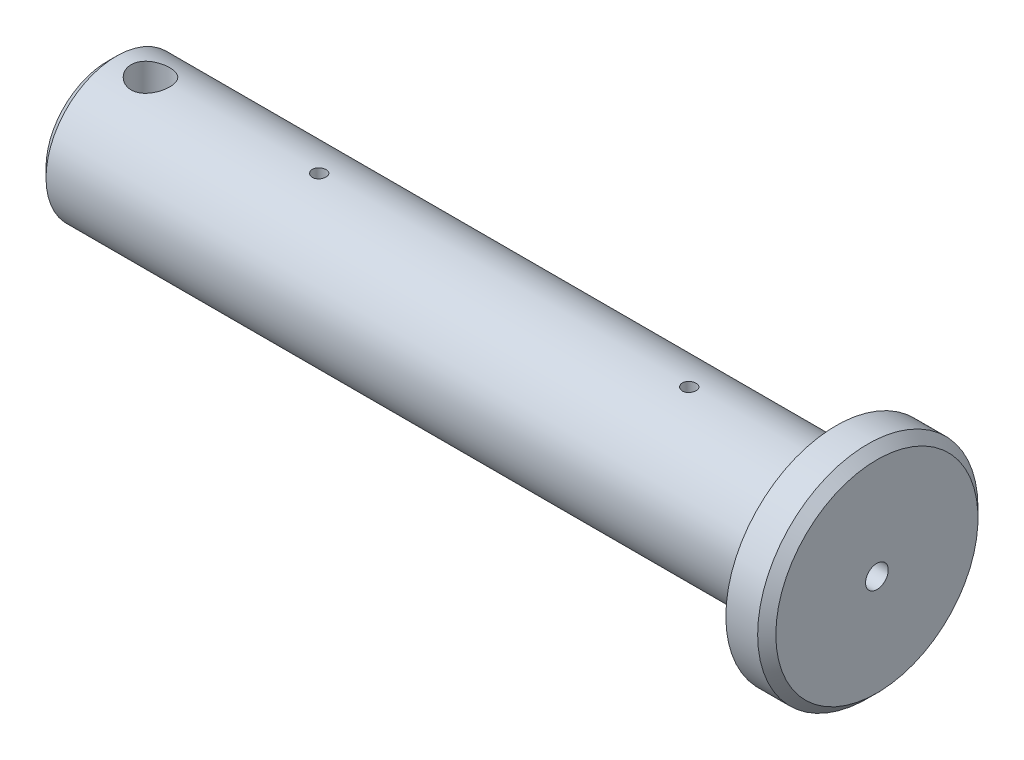
ISO-10303-21;
HEADER;
FILE_DESCRIPTION(('STEP AP214'),'2;1');
FILE_NAME('part.step','',(''),(''),'','','');
FILE_SCHEMA(('AUTOMOTIVE_DESIGN { 1 0 10303 214 1 1 1 1 }'));
ENDSEC;
DATA;
#1=APPLICATION_CONTEXT('core data for automotive mechanical design processes');
#2=APPLICATION_PROTOCOL_DEFINITION('international standard','automotive_design',2000,#1);
#3=PRODUCT_CONTEXT('',#1,'mechanical');
#4=PRODUCT('Part','Part','',(#3));
#5=PRODUCT_RELATED_PRODUCT_CATEGORY('part','',(#4));
#6=PRODUCT_DEFINITION_FORMATION('','',#4);
#7=PRODUCT_DEFINITION_CONTEXT('part definition',#1,'design');
#8=PRODUCT_DEFINITION('design','',#6,#7);
#9=PRODUCT_DEFINITION_SHAPE('','',#8);
#10=(LENGTH_UNIT() NAMED_UNIT(*) SI_UNIT(.MILLI.,.METRE.));
#11=(NAMED_UNIT(*) PLANE_ANGLE_UNIT() SI_UNIT($,.RADIAN.));
#12=(NAMED_UNIT(*) SI_UNIT($,.STERADIAN.) SOLID_ANGLE_UNIT());
#13=UNCERTAINTY_MEASURE_WITH_UNIT(LENGTH_MEASURE(1.E-05),#10,'distance_accuracy_value','');
#14=(GEOMETRIC_REPRESENTATION_CONTEXT(3) GLOBAL_UNCERTAINTY_ASSIGNED_CONTEXT((#13)) GLOBAL_UNIT_ASSIGNED_CONTEXT((#10,
#11,#12)) REPRESENTATION_CONTEXT('',''));
#15=CARTESIAN_POINT('',(0.,0.,0.));
#16=DIRECTION('',(0.,0.,1.));
#17=DIRECTION('',(1.,0.,0.));
#18=AXIS2_PLACEMENT_3D('',#15,#16,#17);
#19=CARTESIAN_POINT('',(-84.69,0.,0.));
#20=DIRECTION('',(-1.,0.,0.));
#21=DIRECTION('',(0.,0.,1.));
#22=AXIS2_PLACEMENT_3D('',#19,#20,#21);
#23=CYLINDRICAL_SURFACE('',#22,1.49999999999999);
#24=CARTESIAN_POINT('',(-38.05,0.,0.));
#25=DIRECTION('',(-0.707106781186547,-0.707106781186547,0.));
#26=DIRECTION('',(-0.707106781186547,0.707106781186547,0.));
#27=AXIS2_PLACEMENT_3D('',#24,#25,#26);
#28=ELLIPSE('',#27,2.12132034355964,1.5);
#29=CARTESIAN_POINT('',(-38.05,0.,1.49999999999999));
#30=VERTEX_POINT('',#29);
#31=CARTESIAN_POINT('',(-38.05,0.,-1.49999999999999));
#32=VERTEX_POINT('',#31);
#33=EDGE_CURVE('E71',#30,#32,#28,.T.);
#34=ORIENTED_EDGE('',*,*,#33,.F.);
#35=CARTESIAN_POINT('',(-38.05,0.,0.));
#36=DIRECTION('',(-0.707106781186547,0.707106781186547,0.));
#37=DIRECTION('',(-0.707106781186547,-0.707106781186547,0.));
#38=AXIS2_PLACEMENT_3D('',#35,#36,#37);
#39=ELLIPSE('',#38,2.12132034355964,1.5);
#40=EDGE_CURVE('E79',#32,#30,#39,.F.);
#41=ORIENTED_EDGE('',*,*,#40,.F.);
#42=EDGE_LOOP('',(#34,#41));
#43=FACE_BOUND('',#42,.T.);
#44=CARTESIAN_POINT('',(74.0891393809725,0.,0.));
#45=DIRECTION('',(-1.,0.,0.));
#46=DIRECTION('',(0.,0.,1.));
#47=AXIS2_PLACEMENT_3D('',#44,#45,#46);
#48=CIRCLE('',#47,1.5);
#49=CARTESIAN_POINT('',(74.0891393809725,0.,1.5));
#50=VERTEX_POINT('',#49);
#51=EDGE_CURVE('E57',#50,#50,#48,.T.);
#52=ORIENTED_EDGE('',*,*,#51,.F.);
#53=EDGE_LOOP('',(#52));
#54=FACE_BOUND('',#53,.T.);
#55=CARTESIAN_POINT('',(-43.7887090714587,0.,0.));
#56=DIRECTION('',(-1.,0.,0.));
#57=DIRECTION('',(0.,0.,1.));
#58=AXIS2_PLACEMENT_3D('',#55,#56,#57);
#59=CIRCLE('',#58,1.49999999999999);
#60=CARTESIAN_POINT('',(-43.7887090714587,0.,1.49999999999999));
#61=VERTEX_POINT('',#60);
#62=EDGE_CURVE('E11',#61,#61,#59,.T.);
#63=ORIENTED_EDGE('',*,*,#62,.T.);
#64=EDGE_LOOP('',(#63));
#65=FACE_BOUND('',#64,.T.);
#66=CARTESIAN_POINT('',(43.39,0.,0.));
#67=DIRECTION('',(-0.707106781186547,-0.707106781186547,0.));
#68=DIRECTION('',(-0.707106781186547,0.707106781186547,0.));
#69=AXIS2_PLACEMENT_3D('',#66,#67,#68);
#70=ELLIPSE('',#69,2.12132034355964,1.5);
#71=CARTESIAN_POINT('',(43.39,0.,1.49999999999999));
#72=VERTEX_POINT('',#71);
#73=CARTESIAN_POINT('',(43.39,0.,-1.49999999999999));
#74=VERTEX_POINT('',#73);
#75=EDGE_CURVE('E64',#72,#74,#70,.T.);
#76=ORIENTED_EDGE('',*,*,#75,.F.);
#77=CARTESIAN_POINT('',(43.39,0.,0.));
#78=DIRECTION('',(-0.707106781186547,0.707106781186547,0.));
#79=DIRECTION('',(-0.707106781186547,-0.707106781186547,0.));
#80=AXIS2_PLACEMENT_3D('',#77,#78,#79);
#81=ELLIPSE('',#80,2.12132034355964,1.5);
#82=EDGE_CURVE('E88',#74,#72,#81,.F.);
#83=ORIENTED_EDGE('',*,*,#82,.F.);
#84=EDGE_LOOP('',(#76,#83));
#85=FACE_BOUND('',#84,.T.);
#86=ADVANCED_FACE('F43',(#43,#54,#65,#85),#23,.F.);
#87=CARTESIAN_POINT('',(-84.69,0.,0.));
#88=DIRECTION('',(-1.,0.,0.));
#89=DIRECTION('',(0.,0.,1.));
#90=AXIS2_PLACEMENT_3D('',#87,#88,#89);
#91=CYLINDRICAL_SURFACE('',#90,15.5);
#92=CARTESIAN_POINT('',(-75.19,-14.9059551857638,4.25000000000001));
#93=CARTESIAN_POINT('',(-74.9561425685737,-14.9059589746067,4.24999488522443));
#94=CARTESIAN_POINT('',(-74.7222320276617,-14.9115188036944,4.23063214644481));
#95=CARTESIAN_POINT('',(-74.2611843252749,-14.9330861659049,4.15385079292532));
#96=CARTESIAN_POINT('',(-74.034050361403,-14.9490985521307,4.09641450051364));
#97=CARTESIAN_POINT('',(-73.5932927776466,-14.9896241970183,3.94553055670863));
#98=CARTESIAN_POINT('',(-73.3796499481119,-15.014125031094,3.85213551620893));
#99=CARTESIAN_POINT('',(-72.9710273981969,-15.0688509028496,3.6321519553497));
#100=CARTESIAN_POINT('',(-72.7760494313701,-15.0990764775727,3.50556032035812));
#101=CARTESIAN_POINT('',(-72.4051362387553,-15.1627418652733,3.21919692306056));
#102=CARTESIAN_POINT('',(-72.2297675853123,-15.1962412382274,3.05870439202163));
#103=CARTESIAN_POINT('',(-71.9080677612998,-15.2621667890378,2.71064396300684));
#104=CARTESIAN_POINT('',(-71.7617397483361,-15.2945928498733,2.52307312461682));
#105=CARTESIAN_POINT('',(-71.4998913025484,-15.3553854582037,2.12222978962299));
#106=CARTESIAN_POINT('',(-71.3849372578438,-15.3836735693965,1.9085743727651));
#107=CARTESIAN_POINT('',(-71.1927989655239,-15.4323177349871,1.46406257328755));
#108=CARTESIAN_POINT('',(-71.115607969622,-15.452675206464,1.23320927244565));
#109=CARTESIAN_POINT('',(-71.003029534185,-15.4827431563298,0.766771757966202));
#110=CARTESIAN_POINT('',(-70.9666775785766,-15.4926988815174,0.531436426250146));
#111=CARTESIAN_POINT('',(-70.9337712804948,-15.5017004118799,0.0578109376308894));
#112=CARTESIAN_POINT('',(-70.9372099105527,-15.5007481435306,-0.180478690084372));
#113=CARTESIAN_POINT('',(-70.9831148124032,-15.4882193102902,-0.646523777582157));
#114=CARTESIAN_POINT('',(-71.0245385137781,-15.4769265705426,-0.874390731987508));
#115=CARTESIAN_POINT('',(-71.1435493463301,-15.4453227170116,-1.31980593378543));
#116=CARTESIAN_POINT('',(-71.2211385966859,-15.4250110747544,-1.53735357567812));
#117=CARTESIAN_POINT('',(-71.4110565745773,-15.3772368866856,-1.95857637040681));
#118=CARTESIAN_POINT('',(-71.523736087884,-15.3497025975388,-2.16208489172741));
#119=CARTESIAN_POINT('',(-71.7803651564166,-15.2904400787306,-2.54765573900489));
#120=CARTESIAN_POINT('',(-71.9243211055055,-15.2587109920439,-2.72971366804827));
#121=CARTESIAN_POINT('',(-72.2449244246596,-15.1932749745251,-3.07343931000042));
#122=CARTESIAN_POINT('',(-72.4224800354133,-15.1595372699986,-3.23425504529121));
#123=CARTESIAN_POINT('',(-72.8023857546962,-15.0948080169217,-3.52404291190807));
#124=CARTESIAN_POINT('',(-73.0047375580112,-15.0638166563299,-3.65301286479991));
#125=CARTESIAN_POINT('',(-73.430423427954,-15.0079600434263,-3.87614695434802));
#126=CARTESIAN_POINT('',(-73.653891594839,-14.9831381611681,-3.97006688744779));
#127=CARTESIAN_POINT('',(-74.1142991756873,-14.9429632788265,-4.11871871775668));
#128=CARTESIAN_POINT('',(-74.3512350094966,-14.9276077750034,-4.17346097759179));
#129=CARTESIAN_POINT('',(-74.823853307174,-14.9086412339289,-4.24070836537975));
#130=CARTESIAN_POINT('',(-75.0593401472162,-14.9046754782246,-4.2544896602924));
#131=CARTESIAN_POINT('',(-75.5292560465583,-14.9079646659928,-4.24295040309155));
#132=CARTESIAN_POINT('',(-75.7636852227934,-14.9152183369659,-4.21763428537876));
#133=CARTESIAN_POINT('',(-76.2198283303444,-14.9397852018905,-4.12974654456128));
#134=CARTESIAN_POINT('',(-76.44170475715,-14.9568879428801,-4.06795367751815));
#135=CARTESIAN_POINT('',(-76.8719408324438,-14.9990175933463,-3.90974796893046));
#136=CARTESIAN_POINT('',(-77.0802986376794,-15.0240455806992,-3.81333041800276));
#137=CARTESIAN_POINT('',(-77.4828900510291,-15.0799249947055,-3.58605876975781));
#138=CARTESIAN_POINT('',(-77.676687033127,-15.1108974254731,-3.45446167916887));
#139=CARTESIAN_POINT('',(-78.0399157488401,-15.1748967565304,-3.16147897621475));
#140=CARTESIAN_POINT('',(-78.2093426185513,-15.2079240650634,-3.00008743196617));
#141=CARTESIAN_POINT('',(-78.5243801839865,-15.2735419232601,-2.64617301921005));
#142=CARTESIAN_POINT('',(-78.6690976488661,-15.3060877641918,-2.45284504731041));
#143=CARTESIAN_POINT('',(-78.9240321586473,-15.3660370665979,-2.04390471018055));
#144=CARTESIAN_POINT('',(-79.0342510374639,-15.3934408013913,-1.82829353031725));
#145=CARTESIAN_POINT('',(-79.2160288888176,-15.4398416416358,-1.38242251921242));
#146=CARTESIAN_POINT('',(-79.2878791468457,-15.4589018834113,-1.15228833379477));
#147=CARTESIAN_POINT('',(-79.3917084949337,-15.4867465190554,-0.682608118597718));
#148=CARTESIAN_POINT('',(-79.4236969670676,-15.4955333309008,-0.443064317210369));
#149=CARTESIAN_POINT('',(-79.4462791558743,-15.5017196678931,0.0303110813249502));
#150=CARTESIAN_POINT('',(-79.4381796490136,-15.4994786878096,0.264076498197157));
#151=CARTESIAN_POINT('',(-79.3838693918906,-15.4846816527614,0.726785748202853));
#152=CARTESIAN_POINT('',(-79.3376602212142,-15.4721260253226,0.955729780771838));
#153=CARTESIAN_POINT('',(-79.2091977944424,-15.4381889050738,1.40063034563142));
#154=CARTESIAN_POINT('',(-79.1272230594416,-15.4168756844443,1.61667285445488));
#155=CARTESIAN_POINT('',(-78.9298043886581,-15.3676455958708,2.03205974292101));
#156=CARTESIAN_POINT('',(-78.814355558461,-15.3397277623435,2.23140167519126));
#157=CARTESIAN_POINT('',(-78.5495167015816,-15.2792934706519,2.61375767900484));
#158=CARTESIAN_POINT('',(-78.399270066712,-15.2466704959798,2.79616151720711));
#159=CARTESIAN_POINT('',(-78.0707071847019,-15.180912762456,3.13360889027573));
#160=CARTESIAN_POINT('',(-77.892383420301,-15.1477778686939,3.28864507418654));
#161=CARTESIAN_POINT('',(-77.5076626578839,-15.0838420957925,3.5705945393854));
#162=CARTESIAN_POINT('',(-77.3007020291748,-15.0531148378429,3.69675701088007));
#163=CARTESIAN_POINT('',(-76.8676898453251,-14.9985392398652,3.9123222426296));
#164=CARTESIAN_POINT('',(-76.6416501962378,-14.9746866502117,4.00174772672291));
#165=CARTESIAN_POINT('',(-76.2122248559673,-14.9396718733312,4.130366453834));
#166=CARTESIAN_POINT('',(-76.0106003557514,-14.9271339479147,4.17511996078346));
#167=CARTESIAN_POINT('',(-75.6026639463207,-14.910274465581,4.23493706424275));
#168=CARTESIAN_POINT('',(-75.3963526488424,-14.9059518425399,4.25000451320911));
#169=CARTESIAN_POINT('',(-75.19,-14.9059551857638,4.25000000000001));
#170=B_SPLINE_CURVE_WITH_KNOTS('',3,(#92,#93,#94,#95,#96,#97,#98,#99,#100,#101,#102,#103,#104,
#105,#106,#107,#108,#109,#110,#111,#112,#113,#114,#115,#116,#117,#118,#119,#120,#121,#122,#123,
#124,#125,#126,#127,#128,#129,#130,#131,#132,#133,#134,#135,#136,#137,#138,#139,#140,#141,#142,
#143,#144,#145,#146,#147,#148,#149,#150,#151,#152,#153,#154,#155,#156,#157,#158,#159,#160,#161,
#162,#163,#164,#165,#166,#167,#168,#169),.UNSPECIFIED.,.T.,.F.,(4,2,2,2,2,2,2,2,2,2,2,2,2,2,2,2,
2,2,2,2,2,2,2,2,2,2,2,2,2,2,2,2,2,2,2,2,2,2,4),(0.,0.700813005442095,1.40195162871364,
2.10206829737107,2.80225067718094,3.51916932831063,4.2361658877673,4.96535881153612,
5.6944213803148,6.40587747651871,7.11720792342215,7.80958065973359,8.5019939718419,
9.20156422715699,9.90127763088445,10.6236664765061,11.3461047239884,12.0734863818195,
12.8006755735845,13.5049580187297,14.2091605905273,14.8988464856265,15.5886262220461,
16.2943159100148,17.0001462480639,17.7276948828281,18.4552048351627,19.1771102232133,
19.8988456678026,20.5972121802511,21.2955497479553,21.98854352139,22.6816386720414,
23.3940589625466,24.1066703190278,24.8361145903639,25.5651069786263,26.183575204833,
26.8019631651136),.UNSPECIFIED.);
#171=CARTESIAN_POINT('',(-75.19,-14.9059551857638,4.25000000000001));
#172=VERTEX_POINT('',#171);
#173=EDGE_CURVE('E47',#172,#172,#170,.T.);
#174=ORIENTED_EDGE('',*,*,#173,.T.);
#175=EDGE_LOOP('',(#174));
#176=FACE_BOUND('',#175,.T.);
#177=CARTESIAN_POINT('',(-75.19,14.9059551857638,4.25000000000001));
#178=CARTESIAN_POINT('',(-75.4238574314264,14.9059589746067,4.24999488522443));
#179=CARTESIAN_POINT('',(-75.6577679723383,14.9115188036944,4.23063214644481));
#180=CARTESIAN_POINT('',(-76.1188156747251,14.9330861659049,4.15385079292532));
#181=CARTESIAN_POINT('',(-76.345949638597,14.9490985521307,4.09641450051364));
#182=CARTESIAN_POINT('',(-76.7867072223534,14.9896241970183,3.94553055670863));
#183=CARTESIAN_POINT('',(-77.0003500518882,15.014125031094,3.85213551620893));
#184=CARTESIAN_POINT('',(-77.4089726018032,15.0688509028496,3.6321519553497));
#185=CARTESIAN_POINT('',(-77.6039505686299,15.0990764775727,3.50556032035812));
#186=CARTESIAN_POINT('',(-77.9748637612447,15.1627418652733,3.21919692306056));
#187=CARTESIAN_POINT('',(-78.1502324146877,15.1962412382274,3.05870439202163));
#188=CARTESIAN_POINT('',(-78.4719322387002,15.2621667890378,2.71064396300684));
#189=CARTESIAN_POINT('',(-78.618260251664,15.2945928498733,2.52307312461682));
#190=CARTESIAN_POINT('',(-78.8801086974516,15.3553854582037,2.12222978962299));
#191=CARTESIAN_POINT('',(-78.9950627421562,15.3836735693965,1.9085743727651));
#192=CARTESIAN_POINT('',(-79.1872010344762,15.4323177349871,1.46406257328755));
#193=CARTESIAN_POINT('',(-79.264392030378,15.452675206464,1.23320927244565));
#194=CARTESIAN_POINT('',(-79.376970465815,15.4827431563298,0.766771757966203));
#195=CARTESIAN_POINT('',(-79.4133224214235,15.4926988815174,0.531436426250147));
#196=CARTESIAN_POINT('',(-79.4462287195052,15.5017004118799,0.05781093763089));
#197=CARTESIAN_POINT('',(-79.4427900894473,15.5007481435306,-0.180478690084371));
#198=CARTESIAN_POINT('',(-79.3968851875969,15.4882193102902,-0.646523777582157));
#199=CARTESIAN_POINT('',(-79.355461486222,15.4769265705426,-0.874390731987508));
#200=CARTESIAN_POINT('',(-79.2364506536699,15.4453227170116,-1.31980593378543));
#201=CARTESIAN_POINT('',(-79.1588614033142,15.4250110747544,-1.53735357567812));
#202=CARTESIAN_POINT('',(-78.9689434254227,15.3772368866856,-1.95857637040681));
#203=CARTESIAN_POINT('',(-78.8562639121161,15.3497025975388,-2.16208489172742));
#204=CARTESIAN_POINT('',(-78.5996348435834,15.2904400787306,-2.54765573900489));
#205=CARTESIAN_POINT('',(-78.4556788944945,15.2587109920439,-2.72971366804827));
#206=CARTESIAN_POINT('',(-78.1350755753405,15.1932749745251,-3.07343931000042));
#207=CARTESIAN_POINT('',(-77.9575199645867,15.1595372699986,-3.2342550452912));
#208=CARTESIAN_POINT('',(-77.5776142453039,15.0948080169217,-3.52404291190806));
#209=CARTESIAN_POINT('',(-77.3752624419889,15.0638166563299,-3.6530128647999));
#210=CARTESIAN_POINT('',(-76.9495765720461,15.0079600434263,-3.87614695434802));
#211=CARTESIAN_POINT('',(-76.7261084051611,14.9831381611681,-3.97006688744778));
#212=CARTESIAN_POINT('',(-76.2657008243127,14.9429632788265,-4.11871871775667));
#213=CARTESIAN_POINT('',(-76.0287649905035,14.9276077750034,-4.17346097759179));
#214=CARTESIAN_POINT('',(-75.556146692826,14.9086412339289,-4.24070836537975));
#215=CARTESIAN_POINT('',(-75.3206598527839,14.9046754782246,-4.2544896602924));
#216=CARTESIAN_POINT('',(-74.8507439534417,14.9079646659928,-4.24295040309155));
#217=CARTESIAN_POINT('',(-74.6163147772067,14.9152183369659,-4.21763428537876));
#218=CARTESIAN_POINT('',(-74.1601716696556,14.9397852018905,-4.12974654456128));
#219=CARTESIAN_POINT('',(-73.9382952428501,14.9568879428801,-4.06795367751815));
#220=CARTESIAN_POINT('',(-73.5080591675563,14.9990175933463,-3.90974796893046));
#221=CARTESIAN_POINT('',(-73.2997013623206,15.0240455806992,-3.81333041800276));
#222=CARTESIAN_POINT('',(-72.897109948971,15.0799249947055,-3.58605876975781));
#223=CARTESIAN_POINT('',(-72.7033129668731,15.1108974254731,-3.45446167916887));
#224=CARTESIAN_POINT('',(-72.34008425116,15.1748967565304,-3.16147897621475));
#225=CARTESIAN_POINT('',(-72.1706573814487,15.2079240650634,-3.00008743196617));
#226=CARTESIAN_POINT('',(-71.8556198160135,15.2735419232601,-2.64617301921005));
#227=CARTESIAN_POINT('',(-71.7109023511339,15.3060877641918,-2.45284504731041));
#228=CARTESIAN_POINT('',(-71.4559678413528,15.3660370665979,-2.04390471018055));
#229=CARTESIAN_POINT('',(-71.3457489625361,15.3934408013913,-1.82829353031725));
#230=CARTESIAN_POINT('',(-71.1639711111824,15.4398416416358,-1.38242251921242));
#231=CARTESIAN_POINT('',(-71.0921208531543,15.4589018834113,-1.15228833379477));
#232=CARTESIAN_POINT('',(-70.9882915050664,15.4867465190554,-0.682608118597718));
#233=CARTESIAN_POINT('',(-70.9563030329325,15.4955333309008,-0.443064317210369));
#234=CARTESIAN_POINT('',(-70.9337208441257,15.5017196678931,0.0303110813249502));
#235=CARTESIAN_POINT('',(-70.9418203509865,15.4994786878096,0.264076498197157));
#236=CARTESIAN_POINT('',(-70.9961306081095,15.4846816527614,0.726785748202853));
#237=CARTESIAN_POINT('',(-71.0423397787858,15.4721260253226,0.955729780771838));
#238=CARTESIAN_POINT('',(-71.1708022055576,15.4381889050738,1.40063034563142));
#239=CARTESIAN_POINT('',(-71.2527769405584,15.4168756844443,1.61667285445488));
#240=CARTESIAN_POINT('',(-71.4501956113419,15.3676455958708,2.03205974292101));
#241=CARTESIAN_POINT('',(-71.5656444415391,15.3397277623435,2.23140167519126));
#242=CARTESIAN_POINT('',(-71.8304832984184,15.2792934706519,2.61375767900484));
#243=CARTESIAN_POINT('',(-71.980729933288,15.2466704959798,2.79616151720711));
#244=CARTESIAN_POINT('',(-72.3092928152981,15.180912762456,3.13360889027573));
#245=CARTESIAN_POINT('',(-72.487616579699,15.1477778686939,3.28864507418654));
#246=CARTESIAN_POINT('',(-72.8723373421162,15.0838420957925,3.5705945393854));
#247=CARTESIAN_POINT('',(-73.0792979708252,15.0531148378429,3.69675701088007));
#248=CARTESIAN_POINT('',(-73.512310154675,14.9985392398652,3.9123222426296));
#249=CARTESIAN_POINT('',(-73.7383498037622,14.9746866502117,4.00174772672291));
#250=CARTESIAN_POINT('',(-74.1677751440327,14.9396718733312,4.130366453834));
#251=CARTESIAN_POINT('',(-74.3693996442487,14.9271339479147,4.17511996078345));
#252=CARTESIAN_POINT('',(-74.7773360536793,14.910274465581,4.23493706424274));
#253=CARTESIAN_POINT('',(-74.9836473511576,14.9059518425399,4.25000451320911));
#254=CARTESIAN_POINT('',(-75.19,14.9059551857638,4.25000000000001));
#255=B_SPLINE_CURVE_WITH_KNOTS('',3,(#177,#178,#179,#180,#181,#182,#183,#184,#185,#186,#187,
#188,#189,#190,#191,#192,#193,#194,#195,#196,#197,#198,#199,#200,#201,#202,#203,#204,#205,#206,
#207,#208,#209,#210,#211,#212,#213,#214,#215,#216,#217,#218,#219,#220,#221,#222,#223,#224,#225,
#226,#227,#228,#229,#230,#231,#232,#233,#234,#235,#236,#237,#238,#239,#240,#241,#242,#243,#244,
#245,#246,#247,#248,#249,#250,#251,#252,#253,#254),.UNSPECIFIED.,.T.,.F.,(4,2,2,2,2,2,2,2,2,2,2,
2,2,2,2,2,2,2,2,2,2,2,2,2,2,2,2,2,2,2,2,2,2,2,2,2,2,2,4),(0.,0.700813005442095,1.40195162871364,
2.10206829737107,2.80225067718094,3.51916932831063,4.2361658877673,4.96535881153612,
5.6944213803148,6.40587747651871,7.11720792342215,7.80958065973359,8.5019939718419,
9.20156422715699,9.90127763088445,10.6236664765061,11.3461047239884,12.0734863818195,
12.8006755735845,13.5049580187297,14.2091605905273,14.8988464856265,15.5886262220461,
16.2943159100148,17.0001462480639,17.7276948828281,18.4552048351627,19.1771102232133,
19.8988456678026,20.5972121802511,21.2955497479553,21.98854352139,22.6816386720414,
23.3940589625466,24.1066703190278,24.8361145903639,25.5651069786263,26.183575204833,
26.8019631651136),.UNSPECIFIED.);
#256=CARTESIAN_POINT('',(-75.19,14.9059551857638,4.25000000000001));
#257=VERTEX_POINT('',#256);
#258=EDGE_CURVE('E207',#257,#257,#255,.T.);
#259=ORIENTED_EDGE('',*,*,#258,.T.);
#260=EDGE_LOOP('',(#259));
#261=FACE_BOUND('',#260,.T.);
#262=CARTESIAN_POINT('',(-82.69,0.,0.));
#263=DIRECTION('',(-1.,0.,0.));
#264=DIRECTION('',(0.,0.,1.));
#265=AXIS2_PLACEMENT_3D('',#262,#263,#264);
#266=CIRCLE('',#265,15.5);
#267=CARTESIAN_POINT('',(-82.69,0.,15.5));
#268=VERTEX_POINT('',#267);
#269=EDGE_CURVE('E96',#268,#268,#266,.T.);
#270=ORIENTED_EDGE('',*,*,#269,.F.);
#271=EDGE_LOOP('',(#270));
#272=FACE_BOUND('',#271,.T.);
#273=CARTESIAN_POINT('',(75.69,0.,0.));
#274=DIRECTION('',(-1.,0.,0.));
#275=DIRECTION('',(0.,0.,1.));
#276=AXIS2_PLACEMENT_3D('',#273,#274,#275);
#277=CIRCLE('',#276,15.5);
#278=CARTESIAN_POINT('',(75.69,0.,15.5));
#279=VERTEX_POINT('',#278);
#280=EDGE_CURVE('E99',#279,#279,#277,.T.);
#281=ORIENTED_EDGE('',*,*,#280,.T.);
#282=EDGE_LOOP('',(#281));
#283=FACE_BOUND('',#282,.T.);
#284=CARTESIAN_POINT('',(-38.05,15.4272486205415,-1.5));
#285=CARTESIAN_POINT('',(-38.134043730073,15.4272495762053,-1.49999635273367));
#286=CARTESIAN_POINT('',(-38.2181433720592,15.4279427937306,-1.49291286811258));
#287=CARTESIAN_POINT('',(-38.3840119532648,15.430640453035,-1.46476190343446));
#288=CARTESIAN_POINT('',(-38.4657782040165,15.4326463482579,-1.4436789222522));
#289=CARTESIAN_POINT('',(-38.6245538949481,15.437740070862,-1.38814775669282));
#290=CARTESIAN_POINT('',(-38.7015661481888,15.4408272510593,-1.35370756571673));
#291=CARTESIAN_POINT('',(-38.848699885738,15.4477348969845,-1.27245473516317));
#292=CARTESIAN_POINT('',(-38.9188227563866,15.4515552147255,-1.22564459179643));
#293=CARTESIAN_POINT('',(-39.0504436163967,15.4595132994192,-1.12080875101044));
#294=CARTESIAN_POINT('',(-39.1119147870709,15.4636519945188,-1.06274945008663));
#295=CARTESIAN_POINT('',(-39.2242564744044,15.4717720678067,-0.937135068924943));
#296=CARTESIAN_POINT('',(-39.2751265106472,15.4757534388588,-0.869579558575183));
#297=CARTESIAN_POINT('',(-39.3649139827561,15.4831193712265,-0.726726902551949));
#298=CARTESIAN_POINT('',(-39.4038077793397,15.4865027466554,-0.65141483248059));
#299=CARTESIAN_POINT('',(-39.468387494921,15.4922813908854,-0.495290605452276));
#300=CARTESIAN_POINT('',(-39.4940737169754,15.4946766823585,-0.414478574743815));
#301=CARTESIAN_POINT('',(-39.531430753443,15.4982027647793,-0.249918644261419));
#302=CARTESIAN_POINT('',(-39.5431454977945,15.4993375184079,-0.166180803353741));
#303=CARTESIAN_POINT('',(-39.5523629416128,15.5002281367855,0.00207964718939861));
#304=CARTESIAN_POINT('',(-39.549865987961,15.4999840351898,0.0866022376203045));
#305=CARTESIAN_POINT('',(-39.5307666308892,15.49814769549,0.253734755360418));
#306=CARTESIAN_POINT('',(-39.5142114658392,15.4965599722815,0.336350137444744));
#307=CARTESIAN_POINT('',(-39.4675391885325,15.4922200429903,0.497624182324234));
#308=CARTESIAN_POINT('',(-39.4374219097363,15.4894678226079,0.576282796518045));
#309=CARTESIAN_POINT('',(-39.3644283521634,15.4831006026184,0.727559671700198));
#310=CARTESIAN_POINT('',(-39.3215311173508,15.4794841878842,0.800167759083598));
#311=CARTESIAN_POINT('',(-39.2242105589952,15.471794498963,0.937171486028484));
#312=CARTESIAN_POINT('',(-39.1697869190245,15.4677212122353,1.00156690005453));
#313=CARTESIAN_POINT('',(-39.0506926504523,15.4595553186037,1.12059391195513));
#314=CARTESIAN_POINT('',(-38.9859809384033,15.4554627009385,1.17518441075973));
#315=CARTESIAN_POINT('',(-38.8482900466098,15.4477360955615,1.27273391927944));
#316=CARTESIAN_POINT('',(-38.775310856085,15.4441021084478,1.31569291382736));
#317=CARTESIAN_POINT('',(-38.6231255999824,15.4377038172581,1.38875948355566));
#318=CARTESIAN_POINT('',(-38.5439183484872,15.4349396793182,1.41886460411144));
#319=CARTESIAN_POINT('',(-38.3815405977482,15.4305974532704,1.46533676335695));
#320=CARTESIAN_POINT('',(-38.2983702115023,15.4290193313679,1.48170419349198));
#321=CARTESIAN_POINT('',(-38.1307876559757,15.427233596907,1.50018366727273));
#322=CARTESIAN_POINT('',(-38.0463818792272,15.4270204603027,1.50235317019412));
#323=CARTESIAN_POINT('',(-37.8784079526453,15.4279742507011,1.49252602553122));
#324=CARTESIAN_POINT('',(-37.7948397922382,15.4291411602604,1.48052955700142));
#325=CARTESIAN_POINT('',(-37.6310802517454,15.4327185338479,1.44275904299401));
#326=CARTESIAN_POINT('',(-37.5508825642072,15.4351265519335,1.41701209298938));
#327=CARTESIAN_POINT('',(-37.3959445656141,15.4409128261549,1.35249911505811));
#328=CARTESIAN_POINT('',(-37.3212043719019,15.4442911031447,1.31373280729956));
#329=CARTESIAN_POINT('',(-37.1790408441439,15.4516506249983,1.22413730423843));
#330=CARTESIAN_POINT('',(-37.1116416339403,15.4556337606302,1.17326998871048));
#331=CARTESIAN_POINT('',(-36.9863177520479,15.4637479703292,1.06097113074415));
#332=CARTESIAN_POINT('',(-36.928393300075,15.4678790478245,0.999539343387764));
#333=CARTESIAN_POINT('',(-36.8234654680511,15.4758403013341,0.867606294585207));
#334=CARTESIAN_POINT('',(-36.7764995406048,15.479669416663,0.797075173763887));
#335=CARTESIAN_POINT('',(-36.6950795158334,15.4865798986659,0.649093330751937));
#336=CARTESIAN_POINT('',(-36.660625256567,15.4896612750178,0.571642698138169));
#337=CARTESIAN_POINT('',(-36.6052702366564,15.494724282397,0.412151825857681));
#338=CARTESIAN_POINT('',(-36.584346743334,15.4967077571672,0.330119536999963));
#339=CARTESIAN_POINT('',(-36.5565729830339,15.4993590266409,0.163686026176502));
#340=CARTESIAN_POINT('',(-36.5497223474035,15.500026855809,0.0792848663244357));
#341=CARTESIAN_POINT('',(-36.5502937627329,15.4999715850939,-0.089122407698886));
#342=CARTESIAN_POINT('',(-36.5576576256519,15.4992541558592,-0.173128727243041));
#343=CARTESIAN_POINT('',(-36.5863271283409,15.4965201712153,-0.338705098694834));
#344=CARTESIAN_POINT('',(-36.6076327809065,15.4945036146139,-0.420275148366415));
#345=CARTESIAN_POINT('',(-36.6635652191636,15.4893973785399,-0.578663911447218));
#346=CARTESIAN_POINT('',(-36.6981904340446,15.4863078256128,-0.655483183888337));
#347=CARTESIAN_POINT('',(-36.7797728385726,15.479400249659,-0.802228516090091));
#348=CARTESIAN_POINT('',(-36.8267299307677,15.4755822323889,-0.872154630317413));
#349=CARTESIAN_POINT('',(-36.9318614903022,15.4676269442836,-1.0034268733249));
#350=CARTESIAN_POINT('',(-36.9900792501062,15.4634884795258,-1.06473825878138));
#351=CARTESIAN_POINT('',(-37.1159953022832,15.4553688521359,-1.17674814744616));
#352=CARTESIAN_POINT('',(-37.1836958705027,15.4513877275599,-1.22744409567171));
#353=CARTESIAN_POINT('',(-37.3268320881815,15.4440232805444,-1.31687873837621));
#354=CARTESIAN_POINT('',(-37.402285922999,15.4406414166868,-1.35558842513088));
#355=CARTESIAN_POINT('',(-37.5586063696469,15.434875848275,-1.41973743997564));
#356=CARTESIAN_POINT('',(-37.639466733897,15.4324910139469,-1.44519179629026));
#357=CARTESIAN_POINT('',(-37.7756575144106,15.4295934282093,-1.47573184740526));
#358=CARTESIAN_POINT('',(-37.830116104751,15.4287182593573,-1.48482003833326));
#359=CARTESIAN_POINT('',(-37.9397084375171,15.4275455430393,-1.49695529980203));
#360=CARTESIAN_POINT('',(-37.9948421773318,15.4272479933402,-1.50000239369753));
#361=CARTESIAN_POINT('',(-38.05,15.4272486205415,-1.5));
#362=B_SPLINE_CURVE_WITH_KNOTS('',3,(#284,#285,#286,#287,#288,#289,#290,#291,#292,#293,#294,
#295,#296,#297,#298,#299,#300,#301,#302,#303,#304,#305,#306,#307,#308,#309,#310,#311,#312,#313,
#314,#315,#316,#317,#318,#319,#320,#321,#322,#323,#324,#325,#326,#327,#328,#329,#330,#331,#332,
#333,#334,#335,#336,#337,#338,#339,#340,#341,#342,#343,#344,#345,#346,#347,#348,#349,#350,#351,
#352,#353,#354,#355,#356,#357,#358,#359,#360,#361),.UNSPECIFIED.,.T.,.F.,(4,2,2,2,2,2,2,2,2,2,2,
2,2,2,2,2,2,2,2,2,2,2,2,2,2,2,2,2,2,2,2,2,2,2,2,2,2,2,4),(0.,0.251929770973533,
0.504138960670295,0.756197452261746,1.00820511817074,1.26097752306989,1.51376138048255,
1.76704104296288,2.02031489351108,2.27279026822666,2.52525948051238,2.77688368804001,
3.02851098553733,3.28055318345279,3.53260230143071,3.78568445188924,4.03876693235871,
4.29189772082747,4.54502129627715,4.79711983905144,5.04921519539427,5.3008156181168,
5.55242144896545,5.80483062864563,6.05724566076133,6.31051112512718,6.56377331130815,
6.81660888534425,7.06943783601312,7.32123400826627,7.57303041161587,7.82479712906295,
8.07656185700128,8.32931447537208,8.58212785790734,8.83554837189727,9.0886809415155,
9.25402285746395,9.41936413420286),.UNSPECIFIED.);
#363=CARTESIAN_POINT('',(-38.05,15.4272486205415,-1.5));
#364=VERTEX_POINT('',#363);
#365=EDGE_CURVE('E82',#364,#364,#362,.T.);
#366=ORIENTED_EDGE('',*,*,#365,.F.);
#367=EDGE_LOOP('',(#366));
#368=FACE_BOUND('',#367,.T.);
#369=CARTESIAN_POINT('',(43.39,15.4272486205415,-1.5));
#370=CARTESIAN_POINT('',(43.305956269927,15.4272495762053,-1.49999635273367));
#371=CARTESIAN_POINT('',(43.2218566279408,15.4279427937306,-1.49291286811258));
#372=CARTESIAN_POINT('',(43.0559880467352,15.430640453035,-1.46476190343446));
#373=CARTESIAN_POINT('',(42.9742217959835,15.4326463482579,-1.44367892225219));
#374=CARTESIAN_POINT('',(42.8154461050519,15.437740070862,-1.38814775669282));
#375=CARTESIAN_POINT('',(42.7384338518112,15.4408272510593,-1.35370756571673));
#376=CARTESIAN_POINT('',(42.591300114262,15.4477348969845,-1.27245473516317));
#377=CARTESIAN_POINT('',(42.5211772436134,15.4515552147255,-1.22564459179643));
#378=CARTESIAN_POINT('',(42.3895563836033,15.4595132994192,-1.12080875101044));
#379=CARTESIAN_POINT('',(42.3280852129291,15.4636519945188,-1.06274945008663));
#380=CARTESIAN_POINT('',(42.2157435255956,15.4717720678067,-0.937135068924942));
#381=CARTESIAN_POINT('',(42.1648734893527,15.4757534388588,-0.869579558575182));
#382=CARTESIAN_POINT('',(42.0750860172439,15.4831193712265,-0.726726902551948));
#383=CARTESIAN_POINT('',(42.0361922206603,15.4865027466554,-0.651414832480588));
#384=CARTESIAN_POINT('',(41.971612505079,15.4922813908854,-0.495290605452275));
#385=CARTESIAN_POINT('',(41.9459262830246,15.4946766823585,-0.414478574743814));
#386=CARTESIAN_POINT('',(41.908569246557,15.4982027647793,-0.249918644261418));
#387=CARTESIAN_POINT('',(41.8968545022055,15.4993375184079,-0.16618080335374));
#388=CARTESIAN_POINT('',(41.8876370583871,15.5002281367855,0.00207964718940013));
#389=CARTESIAN_POINT('',(41.890134012039,15.4999840351898,0.086602237620306));
#390=CARTESIAN_POINT('',(41.9092333691108,15.49814769549,0.253734755360421));
#391=CARTESIAN_POINT('',(41.9257885341608,15.4965599722815,0.336350137444747));
#392=CARTESIAN_POINT('',(41.9724608114675,15.4922200429903,0.497624182324237));
#393=CARTESIAN_POINT('',(42.0025780902637,15.4894678226079,0.576282796518047));
#394=CARTESIAN_POINT('',(42.0755716478366,15.4831006026184,0.727559671700199));
#395=CARTESIAN_POINT('',(42.1184688826492,15.4794841878842,0.8001677590836));
#396=CARTESIAN_POINT('',(42.2157894410048,15.471794498963,0.937171486028485));
#397=CARTESIAN_POINT('',(42.2702130809755,15.4677212122353,1.00156690005453));
#398=CARTESIAN_POINT('',(42.3893073495477,15.4595553186037,1.12059391195513));
#399=CARTESIAN_POINT('',(42.4540190615967,15.4554627009385,1.17518441075973));
#400=CARTESIAN_POINT('',(42.5917099533902,15.4477360955615,1.27273391927944));
#401=CARTESIAN_POINT('',(42.664689143915,15.4441021084478,1.31569291382736));
#402=CARTESIAN_POINT('',(42.8168744000176,15.4377038172581,1.38875948355566));
#403=CARTESIAN_POINT('',(42.8960816515128,15.4349396793182,1.41886460411144));
#404=CARTESIAN_POINT('',(43.0584594022518,15.4305974532704,1.46533676335695));
#405=CARTESIAN_POINT('',(43.1416297884977,15.4290193313679,1.48170419349198));
#406=CARTESIAN_POINT('',(43.3092123440242,15.427233596907,1.50018366727273));
#407=CARTESIAN_POINT('',(43.3936181207728,15.4270204603027,1.50235317019412));
#408=CARTESIAN_POINT('',(43.5615920473547,15.4279742507011,1.49252602553122));
#409=CARTESIAN_POINT('',(43.6451602077618,15.4291411602604,1.48052955700143));
#410=CARTESIAN_POINT('',(43.8089197482546,15.4327185338479,1.44275904299401));
#411=CARTESIAN_POINT('',(43.8891174357928,15.4351265519335,1.41701209298938));
#412=CARTESIAN_POINT('',(44.0440554343859,15.4409128261549,1.35249911505811));
#413=CARTESIAN_POINT('',(44.118795628098,15.4442911031447,1.31373280729956));
#414=CARTESIAN_POINT('',(44.2609591558561,15.4516506249983,1.22413730423843));
#415=CARTESIAN_POINT('',(44.3283583660597,15.4556337606302,1.17326998871048));
#416=CARTESIAN_POINT('',(44.4536822479521,15.4637479703292,1.06097113074415));
#417=CARTESIAN_POINT('',(44.511606699925,15.4678790478245,0.999539343387764));
#418=CARTESIAN_POINT('',(44.6165345319489,15.4758403013341,0.867606294585207));
#419=CARTESIAN_POINT('',(44.6635004593952,15.479669416663,0.797075173763887));
#420=CARTESIAN_POINT('',(44.7449204841666,15.4865798986659,0.649093330751937));
#421=CARTESIAN_POINT('',(44.779374743433,15.4896612750178,0.571642698138169));
#422=CARTESIAN_POINT('',(44.8347297633436,15.494724282397,0.412151825857682));
#423=CARTESIAN_POINT('',(44.855653256666,15.4967077571672,0.330119536999964));
#424=CARTESIAN_POINT('',(44.8834270169661,15.4993590266409,0.163686026176504));
#425=CARTESIAN_POINT('',(44.8902776525965,15.500026855809,0.0792848663244372));
#426=CARTESIAN_POINT('',(44.8897062372671,15.4999715850939,-0.089122407698885));
#427=CARTESIAN_POINT('',(44.8823423743481,15.4992541558592,-0.17312872724304));
#428=CARTESIAN_POINT('',(44.8536728716591,15.4965201712153,-0.338705098694833));
#429=CARTESIAN_POINT('',(44.8323672190935,15.4945036146139,-0.420275148366414));
#430=CARTESIAN_POINT('',(44.7764347808364,15.4893973785399,-0.578663911447216));
#431=CARTESIAN_POINT('',(44.7418095659554,15.4863078256128,-0.655483183888335));
#432=CARTESIAN_POINT('',(44.6602271614274,15.479400249659,-0.802228516090089));
#433=CARTESIAN_POINT('',(44.6132700692323,15.4755822323889,-0.872154630317412));
#434=CARTESIAN_POINT('',(44.5081385096978,15.4676269442836,-1.0034268733249));
#435=CARTESIAN_POINT('',(44.4499207498938,15.4634884795258,-1.06473825878138));
#436=CARTESIAN_POINT('',(44.3240046977168,15.4553688521359,-1.17674814744616));
#437=CARTESIAN_POINT('',(44.2563041294973,15.4513877275599,-1.22744409567171));
#438=CARTESIAN_POINT('',(44.1131679118185,15.4440232805444,-1.31687873837621));
#439=CARTESIAN_POINT('',(44.037714077001,15.4406414166868,-1.35558842513088));
#440=CARTESIAN_POINT('',(43.8813936303531,15.434875848275,-1.41973743997564));
#441=CARTESIAN_POINT('',(43.800533266103,15.4324910139469,-1.44519179629026));
#442=CARTESIAN_POINT('',(43.6643424855894,15.4295934282093,-1.47573184740525));
#443=CARTESIAN_POINT('',(43.609883895249,15.4287182593573,-1.48482003833326));
#444=CARTESIAN_POINT('',(43.5002915624829,15.4275455430393,-1.49695529980203));
#445=CARTESIAN_POINT('',(43.4451578226682,15.4272479933402,-1.50000239369753));
#446=CARTESIAN_POINT('',(43.39,15.4272486205415,-1.5));
#447=B_SPLINE_CURVE_WITH_KNOTS('',3,(#369,#370,#371,#372,#373,#374,#375,#376,#377,#378,#379,
#380,#381,#382,#383,#384,#385,#386,#387,#388,#389,#390,#391,#392,#393,#394,#395,#396,#397,#398,
#399,#400,#401,#402,#403,#404,#405,#406,#407,#408,#409,#410,#411,#412,#413,#414,#415,#416,#417,
#418,#419,#420,#421,#422,#423,#424,#425,#426,#427,#428,#429,#430,#431,#432,#433,#434,#435,#436,
#437,#438,#439,#440,#441,#442,#443,#444,#445,#446),.UNSPECIFIED.,.T.,.F.,(4,2,2,2,2,2,2,2,2,2,2,
2,2,2,2,2,2,2,2,2,2,2,2,2,2,2,2,2,2,2,2,2,2,2,2,2,2,2,4),(0.,0.251929770973533,
0.504138960670295,0.756197452261739,1.00820511817073,1.26097752306989,1.51376138048255,
1.76704104296288,2.02031489351108,2.27279026822666,2.52525948051238,2.77688368804002,
3.02851098553733,3.28055318345279,3.53260230143071,3.78568445188924,4.03876693235871,
4.29189772082747,4.54502129627715,4.79711983905144,5.04921519539427,5.30081561811681,
5.55242144896545,5.80483062864564,6.05724566076133,6.31051112512719,6.56377331130815,
6.81660888534425,7.06943783601312,7.32123400826628,7.57303041161587,7.82479712906295,
8.07656185700128,8.32931447537208,8.58212785790735,8.83554837189728,9.08868094151551,
9.25402285746395,9.41936413420287),.UNSPECIFIED.);
#448=CARTESIAN_POINT('',(43.39,15.4272486205415,-1.5));
#449=VERTEX_POINT('',#448);
#450=EDGE_CURVE('E85',#449,#449,#447,.T.);
#451=ORIENTED_EDGE('',*,*,#450,.F.);
#452=EDGE_LOOP('',(#451));
#453=FACE_BOUND('',#452,.T.);
#454=ADVANCED_FACE('F128',(#176,#261,#272,#283,#368,#453),#91,.T.);
#455=CARTESIAN_POINT('',(-44.69,0.,0.));
#456=DIRECTION('',(1.,0.,0.));
#457=DIRECTION('',(0.,0.,-1.));
#458=AXIS2_PLACEMENT_3D('',#455,#456,#457);
#459=CONICAL_SURFACE('',#458,0.,1.02974425867666);
#460=ORIENTED_EDGE('',*,*,#62,.F.);
#461=EDGE_LOOP('',(#460));
#462=FACE_BOUND('',#461,.T.);
#463=CARTESIAN_POINT('',(-44.69,0.,0.));
#464=VERTEX_POINT('',#463);
#465=VERTEX_LOOP('',#464);
#466=FACE_BOUND('',#465,.T.);
#467=ADVANCED_FACE('F45',(#462,#466),#459,.F.);
#468=CARTESIAN_POINT('',(74.0891393809725,0.,0.));
#469=DIRECTION('',(1.,0.,0.));
#470=DIRECTION('',(0.,0.,-1.));
#471=AXIS2_PLACEMENT_3D('',#468,#469,#470);
#472=CONICAL_SURFACE('',#471,1.5,1.02974425867667);
#473=CARTESIAN_POINT('',(74.69,0.,0.));
#474=DIRECTION('',(-1.,0.,0.));
#475=DIRECTION('',(0.,0.,1.));
#476=AXIS2_PLACEMENT_3D('',#473,#474,#475);
#477=CIRCLE('',#476,2.5);
#478=CARTESIAN_POINT('',(74.69,0.,2.5));
#479=VERTEX_POINT('',#478);
#480=EDGE_CURVE('E114',#479,#479,#477,.T.);
#481=ORIENTED_EDGE('',*,*,#480,.F.);
#482=EDGE_LOOP('',(#481));
#483=FACE_BOUND('',#482,.T.);
#484=ORIENTED_EDGE('',*,*,#51,.T.);
#485=EDGE_LOOP('',(#484));
#486=FACE_BOUND('',#485,.T.);
#487=ADVANCED_FACE('F158',(#483,#486),#472,.F.);
#488=CARTESIAN_POINT('',(-84.69,0.,0.));
#489=DIRECTION('',(-1.,0.,0.));
#490=DIRECTION('',(0.,0.,1.));
#491=AXIS2_PLACEMENT_3D('',#488,#489,#490);
#492=CYLINDRICAL_SURFACE('',#491,2.5);
#493=CARTESIAN_POINT('',(84.69,0.,0.));
#494=DIRECTION('',(-1.,0.,0.));
#495=DIRECTION('',(0.,0.,1.));
#496=AXIS2_PLACEMENT_3D('',#493,#494,#495);
#497=CIRCLE('',#496,2.5);
#498=CARTESIAN_POINT('',(84.69,0.,2.5));
#499=VERTEX_POINT('',#498);
#500=EDGE_CURVE('E111',#499,#499,#497,.T.);
#501=ORIENTED_EDGE('',*,*,#500,.F.);
#502=EDGE_LOOP('',(#501));
#503=FACE_BOUND('',#502,.T.);
#504=ORIENTED_EDGE('',*,*,#480,.T.);
#505=EDGE_LOOP('',(#504));
#506=FACE_BOUND('',#505,.T.);
#507=ADVANCED_FACE('F161',(#503,#506),#492,.F.);
#508=CARTESIAN_POINT('',(84.69,2.5,0.));
#509=DIRECTION('',(-1.,0.,0.));
#510=DIRECTION('',(0.,0.,1.));
#511=AXIS2_PLACEMENT_3D('',#508,#509,#510);
#512=PLANE('',#511);
#513=CARTESIAN_POINT('',(84.69,0.,0.));
#514=DIRECTION('',(-1.,0.,0.));
#515=DIRECTION('',(0.,0.,1.));
#516=AXIS2_PLACEMENT_3D('',#513,#514,#515);
#517=CIRCLE('',#516,22.25);
#518=CARTESIAN_POINT('',(84.69,0.,22.25));
#519=VERTEX_POINT('',#518);
#520=EDGE_CURVE('E108',#519,#519,#517,.T.);
#521=ORIENTED_EDGE('',*,*,#520,.F.);
#522=EDGE_LOOP('',(#521));
#523=FACE_BOUND('',#522,.T.);
#524=ORIENTED_EDGE('',*,*,#500,.T.);
#525=EDGE_LOOP('',(#524));
#526=FACE_BOUND('',#525,.T.);
#527=ADVANCED_FACE('F165',(#523,#526),#512,.F.);
#528=CARTESIAN_POINT('',(84.69,0.,0.));
#529=DIRECTION('',(-1.,0.,0.));
#530=DIRECTION('',(0.,0.,1.));
#531=AXIS2_PLACEMENT_3D('',#528,#529,#530);
#532=CONICAL_SURFACE('',#531,22.25,0.785398163397448);
#533=CARTESIAN_POINT('',(82.69,0.,0.));
#534=DIRECTION('',(-1.,0.,0.));
#535=DIRECTION('',(0.,0.,1.));
#536=AXIS2_PLACEMENT_3D('',#533,#534,#535);
#537=CIRCLE('',#536,24.25);
#538=CARTESIAN_POINT('',(82.69,0.,24.25));
#539=VERTEX_POINT('',#538);
#540=EDGE_CURVE('E105',#539,#539,#537,.T.);
#541=ORIENTED_EDGE('',*,*,#540,.F.);
#542=EDGE_LOOP('',(#541));
#543=FACE_BOUND('',#542,.T.);
#544=ORIENTED_EDGE('',*,*,#520,.T.);
#545=EDGE_LOOP('',(#544));
#546=FACE_BOUND('',#545,.T.);
#547=ADVANCED_FACE('F169',(#543,#546),#532,.T.);
#548=CARTESIAN_POINT('',(-84.69,0.,0.));
#549=DIRECTION('',(-1.,0.,0.));
#550=DIRECTION('',(0.,0.,1.));
#551=AXIS2_PLACEMENT_3D('',#548,#549,#550);
#552=CYLINDRICAL_SURFACE('',#551,24.25);
#553=CARTESIAN_POINT('',(75.69,0.,0.));
#554=DIRECTION('',(-1.,0.,0.));
#555=DIRECTION('',(0.,0.,1.));
#556=AXIS2_PLACEMENT_3D('',#553,#554,#555);
#557=CIRCLE('',#556,24.25);
#558=CARTESIAN_POINT('',(75.69,0.,24.25));
#559=VERTEX_POINT('',#558);
#560=EDGE_CURVE('E102',#559,#559,#557,.T.);
#561=ORIENTED_EDGE('',*,*,#560,.F.);
#562=EDGE_LOOP('',(#561));
#563=FACE_BOUND('',#562,.T.);
#564=ORIENTED_EDGE('',*,*,#540,.T.);
#565=EDGE_LOOP('',(#564));
#566=FACE_BOUND('',#565,.T.);
#567=ADVANCED_FACE('F148',(#563,#566),#552,.T.);
#568=CARTESIAN_POINT('',(75.69,24.25,0.));
#569=DIRECTION('',(1.,0.,0.));
#570=DIRECTION('',(0.,0.,-1.));
#571=AXIS2_PLACEMENT_3D('',#568,#569,#570);
#572=PLANE('',#571);
#573=ORIENTED_EDGE('',*,*,#280,.F.);
#574=EDGE_LOOP('',(#573));
#575=FACE_BOUND('',#574,.T.);
#576=ORIENTED_EDGE('',*,*,#560,.T.);
#577=EDGE_LOOP('',(#576));
#578=FACE_BOUND('',#577,.T.);
#579=ADVANCED_FACE('F143',(#575,#578),#572,.F.);
#580=CARTESIAN_POINT('',(-82.69,0.,0.));
#581=DIRECTION('',(1.,0.,0.));
#582=DIRECTION('',(0.,0.,-1.));
#583=AXIS2_PLACEMENT_3D('',#580,#581,#582);
#584=CONICAL_SURFACE('',#583,15.5,0.785398163397448);
#585=CARTESIAN_POINT('',(-84.69,0.,0.));
#586=DIRECTION('',(-1.,0.,0.));
#587=DIRECTION('',(0.,0.,1.));
#588=AXIS2_PLACEMENT_3D('',#585,#586,#587);
#589=CIRCLE('',#588,13.5);
#590=CARTESIAN_POINT('',(-84.69,0.,13.5));
#591=VERTEX_POINT('',#590);
#592=EDGE_CURVE('E93',#591,#591,#589,.T.);
#593=ORIENTED_EDGE('',*,*,#592,.F.);
#594=EDGE_LOOP('',(#593));
#595=FACE_BOUND('',#594,.T.);
#596=ORIENTED_EDGE('',*,*,#269,.T.);
#597=EDGE_LOOP('',(#596));
#598=FACE_BOUND('',#597,.T.);
#599=ADVANCED_FACE('F140',(#595,#598),#584,.T.);
#600=CARTESIAN_POINT('',(-84.69,13.5,0.));
#601=DIRECTION('',(1.,0.,0.));
#602=DIRECTION('',(0.,0.,-1.));
#603=AXIS2_PLACEMENT_3D('',#600,#601,#602);
#604=PLANE('',#603);
#605=ORIENTED_EDGE('',*,*,#592,.T.);
#606=EDGE_LOOP('',(#605));
#607=FACE_BOUND('',#606,.T.);
#608=ADVANCED_FACE('F136',(#607),#604,.F.);
#609=CARTESIAN_POINT('',(-38.05,24.25,0.));
#610=DIRECTION('',(0.,-1.,0.));
#611=DIRECTION('',(0.,0.,-1.));
#612=AXIS2_PLACEMENT_3D('',#609,#610,#611);
#613=CYLINDRICAL_SURFACE('',#612,1.5);
#614=ORIENTED_EDGE('',*,*,#365,.T.);
#615=EDGE_LOOP('',(#614));
#616=FACE_BOUND('',#615,.T.);
#617=ORIENTED_EDGE('',*,*,#33,.T.);
#618=ORIENTED_EDGE('',*,*,#40,.T.);
#619=EDGE_LOOP('',(#617,#618));
#620=FACE_BOUND('',#619,.T.);
#621=ADVANCED_FACE('F80',(#616,#620),#613,.F.);
#622=CARTESIAN_POINT('',(43.39,24.25,0.));
#623=DIRECTION('',(0.,-1.,0.));
#624=DIRECTION('',(0.,0.,-1.));
#625=AXIS2_PLACEMENT_3D('',#622,#623,#624);
#626=CYLINDRICAL_SURFACE('',#625,1.5);
#627=ORIENTED_EDGE('',*,*,#450,.T.);
#628=EDGE_LOOP('',(#627));
#629=FACE_BOUND('',#628,.T.);
#630=ORIENTED_EDGE('',*,*,#75,.T.);
#631=ORIENTED_EDGE('',*,*,#82,.T.);
#632=EDGE_LOOP('',(#630,#631));
#633=FACE_BOUND('',#632,.T.);
#634=ADVANCED_FACE('F135',(#629,#633),#626,.F.);
#635=CARTESIAN_POINT('',(-75.19,-24.25,0.));
#636=DIRECTION('',(0.,1.,0.));
#637=DIRECTION('',(0.,0.,1.));
#638=AXIS2_PLACEMENT_3D('',#635,#636,#637);
#639=CYLINDRICAL_SURFACE('',#638,4.25000000000001);
#640=ORIENTED_EDGE('',*,*,#258,.F.);
#641=EDGE_LOOP('',(#640));
#642=FACE_BOUND('',#641,.T.);
#643=ORIENTED_EDGE('',*,*,#173,.F.);
#644=EDGE_LOOP('',(#643));
#645=FACE_BOUND('',#644,.T.);
#646=ADVANCED_FACE('F193',(#642,#645),#639,.F.);
#647=CLOSED_SHELL('',(#86,#454,#467,#487,#507,#527,#547,#567,#579,#599,#608,#621,#634,#646));
#648=MANIFOLD_SOLID_BREP('B2',#647);
#649=ADVANCED_BREP_SHAPE_REPRESENTATION('',(#18,#648),#14);
#650=SHAPE_DEFINITION_REPRESENTATION(#9,#649);
ENDSEC;
END-ISO-10303-21;
